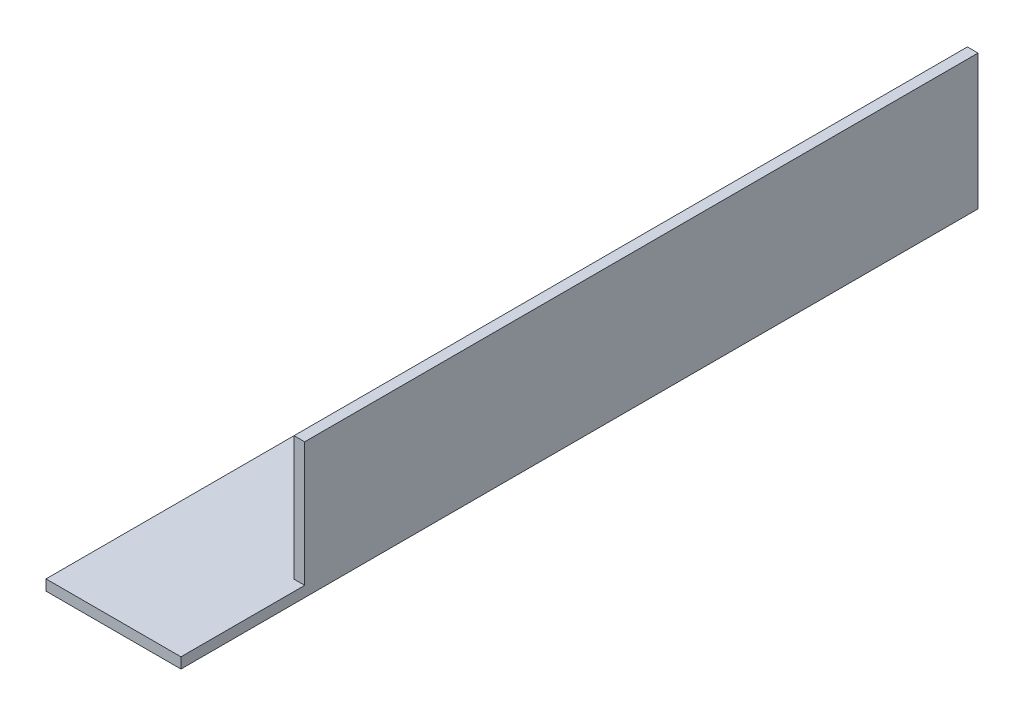
ISO-10303-21;
HEADER;
FILE_DESCRIPTION(('STEP AP214'),'2;1');
FILE_NAME('part.step','',(''),(''),'','','');
FILE_SCHEMA(('AUTOMOTIVE_DESIGN { 1 0 10303 214 1 1 1 1 }'));
ENDSEC;
DATA;
#1=APPLICATION_CONTEXT('core data for automotive mechanical design processes');
#2=APPLICATION_PROTOCOL_DEFINITION('international standard','automotive_design',2000,#1);
#3=PRODUCT_CONTEXT('',#1,'mechanical');
#4=PRODUCT('Part','Part','',(#3));
#5=PRODUCT_RELATED_PRODUCT_CATEGORY('part','',(#4));
#6=PRODUCT_DEFINITION_FORMATION('','',#4);
#7=PRODUCT_DEFINITION_CONTEXT('part definition',#1,'design');
#8=PRODUCT_DEFINITION('design','',#6,#7);
#9=PRODUCT_DEFINITION_SHAPE('','',#8);
#10=(LENGTH_UNIT() NAMED_UNIT(*) SI_UNIT(.MILLI.,.METRE.));
#11=(NAMED_UNIT(*) PLANE_ANGLE_UNIT() SI_UNIT($,.RADIAN.));
#12=(NAMED_UNIT(*) SI_UNIT($,.STERADIAN.) SOLID_ANGLE_UNIT());
#13=UNCERTAINTY_MEASURE_WITH_UNIT(LENGTH_MEASURE(1.E-05),#10,'distance_accuracy_value','');
#14=(GEOMETRIC_REPRESENTATION_CONTEXT(3) GLOBAL_UNCERTAINTY_ASSIGNED_CONTEXT((#13)) GLOBAL_UNIT_ASSIGNED_CONTEXT((#10,
#11,#12)) REPRESENTATION_CONTEXT('',''));
#15=CARTESIAN_POINT('',(0.,0.,0.));
#16=DIRECTION('',(0.,0.,1.));
#17=DIRECTION('',(1.,0.,0.));
#18=AXIS2_PLACEMENT_3D('',#15,#16,#17);
#19=CARTESIAN_POINT('',(0.,2.,150.));
#20=DIRECTION('',(0.,-1.,0.));
#21=DIRECTION('',(1.,0.,0.));
#22=AXIS2_PLACEMENT_3D('',#19,#20,#21);
#23=PLANE('',#22);
#24=DIRECTION('',(-1.,0.,0.));
#25=VECTOR('',#24,1.);
#26=CARTESIAN_POINT('',(0.,2.,0.));
#27=LINE('',#26,#25);
#28=CARTESIAN_POINT('',(-2.,2.,0.));
#29=VERTEX_POINT('',#28);
#30=CARTESIAN_POINT('',(-25.4,2.,0.));
#31=VERTEX_POINT('',#30);
#32=EDGE_CURVE('E116',#29,#31,#27,.T.);
#33=ORIENTED_EDGE('',*,*,#32,.T.);
#34=DIRECTION('',(0.,0.,-1.));
#35=VECTOR('',#34,1.);
#36=CARTESIAN_POINT('',(-25.4,2.,150.));
#37=LINE('',#36,#35);
#38=CARTESIAN_POINT('',(-25.4,2.,150.));
#39=VERTEX_POINT('',#38);
#40=EDGE_CURVE('E40',#39,#31,#37,.T.);
#41=ORIENTED_EDGE('',*,*,#40,.F.);
#42=DIRECTION('',(-1.,0.,0.));
#43=VECTOR('',#42,1.);
#44=CARTESIAN_POINT('',(0.,2.,150.));
#45=LINE('',#44,#43);
#46=CARTESIAN_POINT('',(0.,1.99999999999991,150.));
#47=VERTEX_POINT('',#46);
#48=EDGE_CURVE('E83',#47,#39,#45,.T.);
#49=ORIENTED_EDGE('',*,*,#48,.F.);
#50=DIRECTION('',(0.,0.,-1.));
#51=VECTOR('',#50,1.);
#52=CARTESIAN_POINT('',(0.,1.99999999999992,126.714536818473));
#53=LINE('',#52,#51);
#54=CARTESIAN_POINT('',(0.,1.99999999999992,126.714536818473));
#55=VERTEX_POINT('',#54);
#56=EDGE_CURVE('E107',#47,#55,#53,.T.);
#57=ORIENTED_EDGE('',*,*,#56,.T.);
#58=DIRECTION('',(1.,0.,0.));
#59=VECTOR('',#58,1.);
#60=CARTESIAN_POINT('',(-29.,1.99999999999992,126.714536818473));
#61=LINE('',#60,#59);
#62=CARTESIAN_POINT('',(-2.,1.99999999999992,126.714536818473));
#63=VERTEX_POINT('',#62);
#64=EDGE_CURVE('E99',#63,#55,#61,.T.);
#65=ORIENTED_EDGE('',*,*,#64,.F.);
#66=DIRECTION('',(0.,0.,-1.));
#67=VECTOR('',#66,1.);
#68=CARTESIAN_POINT('',(-2.,2.,150.));
#69=LINE('',#68,#67);
#70=EDGE_CURVE('E78',#63,#29,#69,.T.);
#71=ORIENTED_EDGE('',*,*,#70,.T.);
#72=EDGE_LOOP('',(#33,#41,#49,#57,#65,#71));
#73=FACE_BOUND('',#72,.T.);
#74=ADVANCED_FACE('F32',(#73),#23,.F.);
#75=CARTESIAN_POINT('',(-25.4,0.,150.));
#76=DIRECTION('',(-1.,0.,0.));
#77=DIRECTION('',(0.,0.,1.));
#78=AXIS2_PLACEMENT_3D('',#75,#76,#77);
#79=PLANE('',#78);
#80=DIRECTION('',(0.,1.,0.));
#81=VECTOR('',#80,1.);
#82=CARTESIAN_POINT('',(-25.4,0.,0.));
#83=LINE('',#82,#81);
#84=CARTESIAN_POINT('',(-25.4,0.,0.));
#85=VERTEX_POINT('',#84);
#86=EDGE_CURVE('E127',#85,#31,#83,.T.);
#87=ORIENTED_EDGE('',*,*,#86,.F.);
#88=DIRECTION('',(0.,0.,-1.));
#89=VECTOR('',#88,1.);
#90=CARTESIAN_POINT('',(-25.4,0.,150.));
#91=LINE('',#90,#89);
#92=CARTESIAN_POINT('',(-25.4,0.,150.));
#93=VERTEX_POINT('',#92);
#94=EDGE_CURVE('E145',#93,#85,#91,.T.);
#95=ORIENTED_EDGE('',*,*,#94,.F.);
#96=DIRECTION('',(0.,1.,0.));
#97=VECTOR('',#96,1.);
#98=CARTESIAN_POINT('',(-25.4,0.,150.));
#99=LINE('',#98,#97);
#100=EDGE_CURVE('E118',#93,#39,#99,.T.);
#101=ORIENTED_EDGE('',*,*,#100,.T.);
#102=ORIENTED_EDGE('',*,*,#40,.T.);
#103=EDGE_LOOP('',(#87,#95,#101,#102));
#104=FACE_BOUND('',#103,.T.);
#105=ADVANCED_FACE('F148',(#104),#79,.T.);
#106=CARTESIAN_POINT('',(0.,0.,150.));
#107=DIRECTION('',(0.,-1.,0.));
#108=DIRECTION('',(1.,0.,0.));
#109=AXIS2_PLACEMENT_3D('',#106,#107,#108);
#110=PLANE('',#109);
#111=DIRECTION('',(-1.,0.,0.));
#112=VECTOR('',#111,1.);
#113=CARTESIAN_POINT('',(0.,0.,0.));
#114=LINE('',#113,#112);
#115=CARTESIAN_POINT('',(0.,0.,0.));
#116=VERTEX_POINT('',#115);
#117=EDGE_CURVE('E130',#116,#85,#114,.T.);
#118=ORIENTED_EDGE('',*,*,#117,.F.);
#119=DIRECTION('',(0.,0.,-1.));
#120=VECTOR('',#119,1.);
#121=CARTESIAN_POINT('',(0.,0.,150.));
#122=LINE('',#121,#120);
#123=CARTESIAN_POINT('',(0.,0.,150.));
#124=VERTEX_POINT('',#123);
#125=EDGE_CURVE('E143',#124,#116,#122,.T.);
#126=ORIENTED_EDGE('',*,*,#125,.F.);
#127=DIRECTION('',(-1.,0.,0.));
#128=VECTOR('',#127,1.);
#129=CARTESIAN_POINT('',(0.,0.,150.));
#130=LINE('',#129,#128);
#131=EDGE_CURVE('E122',#124,#93,#130,.T.);
#132=ORIENTED_EDGE('',*,*,#131,.T.);
#133=ORIENTED_EDGE('',*,*,#94,.T.);
#134=EDGE_LOOP('',(#118,#126,#132,#133));
#135=FACE_BOUND('',#134,.T.);
#136=ADVANCED_FACE('F154',(#135),#110,.T.);
#137=CARTESIAN_POINT('',(0.,25.4,150.));
#138=DIRECTION('',(1.,0.,0.));
#139=DIRECTION('',(0.,0.,-1.));
#140=AXIS2_PLACEMENT_3D('',#137,#138,#139);
#141=PLANE('',#140);
#142=ORIENTED_EDGE('',*,*,#56,.F.);
#143=DIRECTION('',(0.,-1.,0.));
#144=VECTOR('',#143,1.);
#145=CARTESIAN_POINT('',(0.,25.4,150.));
#146=LINE('',#145,#144);
#147=EDGE_CURVE('E48',#47,#124,#146,.T.);
#148=ORIENTED_EDGE('',*,*,#147,.T.);
#149=ORIENTED_EDGE('',*,*,#125,.T.);
#150=DIRECTION('',(0.,-1.,0.));
#151=VECTOR('',#150,1.);
#152=CARTESIAN_POINT('',(0.,25.4,0.));
#153=LINE('',#152,#151);
#154=CARTESIAN_POINT('',(0.,25.4,0.));
#155=VERTEX_POINT('',#154);
#156=EDGE_CURVE('E133',#155,#116,#153,.T.);
#157=ORIENTED_EDGE('',*,*,#156,.F.);
#158=DIRECTION('',(0.,0.,-1.));
#159=VECTOR('',#158,1.);
#160=CARTESIAN_POINT('',(0.,25.4,150.));
#161=LINE('',#160,#159);
#162=CARTESIAN_POINT('',(0.,25.4,126.714536818473));
#163=VERTEX_POINT('',#162);
#164=EDGE_CURVE('E112',#163,#155,#161,.T.);
#165=ORIENTED_EDGE('',*,*,#164,.F.);
#166=DIRECTION('',(0.,1.,0.));
#167=VECTOR('',#166,1.);
#168=CARTESIAN_POINT('',(0.,33.5854085161442,126.714536818473));
#169=LINE('',#168,#167);
#170=EDGE_CURVE('E103',#55,#163,#169,.T.);
#171=ORIENTED_EDGE('',*,*,#170,.F.);
#172=EDGE_LOOP('',(#142,#148,#149,#157,#165,#171));
#173=FACE_BOUND('',#172,.T.);
#174=ADVANCED_FACE('F110',(#173),#141,.T.);
#175=CARTESIAN_POINT('',(-2.,25.4,150.));
#176=DIRECTION('',(0.,1.,0.));
#177=DIRECTION('',(0.,0.,1.));
#178=AXIS2_PLACEMENT_3D('',#175,#176,#177);
#179=PLANE('',#178);
#180=DIRECTION('',(-1.,0.,0.));
#181=VECTOR('',#180,1.);
#182=CARTESIAN_POINT('',(-2.,25.4,126.714536818473));
#183=LINE('',#182,#181);
#184=CARTESIAN_POINT('',(-2.,25.4,126.714536818473));
#185=VERTEX_POINT('',#184);
#186=EDGE_CURVE('E105',#163,#185,#183,.T.);
#187=ORIENTED_EDGE('',*,*,#186,.F.);
#188=ORIENTED_EDGE('',*,*,#164,.T.);
#189=DIRECTION('',(1.,0.,0.));
#190=VECTOR('',#189,1.);
#191=CARTESIAN_POINT('',(-2.,25.4,0.));
#192=LINE('',#191,#190);
#193=CARTESIAN_POINT('',(-2.,25.4,0.));
#194=VERTEX_POINT('',#193);
#195=EDGE_CURVE('E136',#194,#155,#192,.T.);
#196=ORIENTED_EDGE('',*,*,#195,.F.);
#197=DIRECTION('',(0.,0.,-1.));
#198=VECTOR('',#197,1.);
#199=CARTESIAN_POINT('',(-2.,25.4,150.));
#200=LINE('',#199,#198);
#201=EDGE_CURVE('E71',#185,#194,#200,.T.);
#202=ORIENTED_EDGE('',*,*,#201,.F.);
#203=EDGE_LOOP('',(#187,#188,#196,#202));
#204=FACE_BOUND('',#203,.T.);
#205=ADVANCED_FACE('F165',(#204),#179,.T.);
#206=CARTESIAN_POINT('',(-2.,25.4,150.));
#207=DIRECTION('',(1.,0.,0.));
#208=DIRECTION('',(0.,0.,-1.));
#209=AXIS2_PLACEMENT_3D('',#206,#207,#208);
#210=PLANE('',#209);
#211=ORIENTED_EDGE('',*,*,#70,.F.);
#212=DIRECTION('',(0.,1.,0.));
#213=VECTOR('',#212,1.);
#214=CARTESIAN_POINT('',(-2.,25.4,126.714536818473));
#215=LINE('',#214,#213);
#216=EDGE_CURVE('E11',#63,#185,#215,.T.);
#217=ORIENTED_EDGE('',*,*,#216,.T.);
#218=ORIENTED_EDGE('',*,*,#201,.T.);
#219=DIRECTION('',(0.,1.,0.));
#220=VECTOR('',#219,1.);
#221=CARTESIAN_POINT('',(-2.,25.4,0.));
#222=LINE('',#221,#220);
#223=EDGE_CURVE('E119',#194,#29,#222,.F.);
#224=ORIENTED_EDGE('',*,*,#223,.T.);
#225=EDGE_LOOP('',(#211,#217,#218,#224));
#226=FACE_BOUND('',#225,.T.);
#227=ADVANCED_FACE('F158',(#226),#210,.F.);
#228=CARTESIAN_POINT('',(0.,0.,150.));
#229=DIRECTION('',(0.,0.,-1.));
#230=DIRECTION('',(-1.,0.,0.));
#231=AXIS2_PLACEMENT_3D('',#228,#229,#230);
#232=PLANE('',#231);
#233=ORIENTED_EDGE('',*,*,#147,.F.);
#234=ORIENTED_EDGE('',*,*,#48,.T.);
#235=ORIENTED_EDGE('',*,*,#100,.F.);
#236=ORIENTED_EDGE('',*,*,#131,.F.);
#237=EDGE_LOOP('',(#233,#234,#235,#236));
#238=FACE_BOUND('',#237,.T.);
#239=ADVANCED_FACE('F156',(#238),#232,.F.);
#240=CARTESIAN_POINT('',(0.,0.,0.));
#241=DIRECTION('',(0.,0.,-1.));
#242=DIRECTION('',(-1.,0.,0.));
#243=AXIS2_PLACEMENT_3D('',#240,#241,#242);
#244=PLANE('',#243);
#245=ORIENTED_EDGE('',*,*,#32,.F.);
#246=ORIENTED_EDGE('',*,*,#223,.F.);
#247=ORIENTED_EDGE('',*,*,#195,.T.);
#248=ORIENTED_EDGE('',*,*,#156,.T.);
#249=ORIENTED_EDGE('',*,*,#117,.T.);
#250=ORIENTED_EDGE('',*,*,#86,.T.);
#251=EDGE_LOOP('',(#245,#246,#247,#248,#249,#250));
#252=FACE_BOUND('',#251,.T.);
#253=ADVANCED_FACE('F151',(#252),#244,.T.);
#254=CARTESIAN_POINT('',(-29.,33.5854085161442,126.714536818473));
#255=DIRECTION('',(0.,0.,-1.));
#256=DIRECTION('',(-1.,0.,0.));
#257=AXIS2_PLACEMENT_3D('',#254,#255,#256);
#258=PLANE('',#257);
#259=ORIENTED_EDGE('',*,*,#186,.T.);
#260=ORIENTED_EDGE('',*,*,#216,.F.);
#261=ORIENTED_EDGE('',*,*,#64,.T.);
#262=ORIENTED_EDGE('',*,*,#170,.T.);
#263=EDGE_LOOP('',(#259,#260,#261,#262));
#264=FACE_BOUND('',#263,.T.);
#265=ADVANCED_FACE('F101',(#264),#258,.F.);
#266=CLOSED_SHELL('',(#74,#105,#136,#174,#205,#227,#239,#253,#265));
#267=MANIFOLD_SOLID_BREP('B2',#266);
#268=ADVANCED_BREP_SHAPE_REPRESENTATION('',(#18,#267),#14);
#269=SHAPE_DEFINITION_REPRESENTATION(#9,#268);
ENDSEC;
END-ISO-10303-21;
